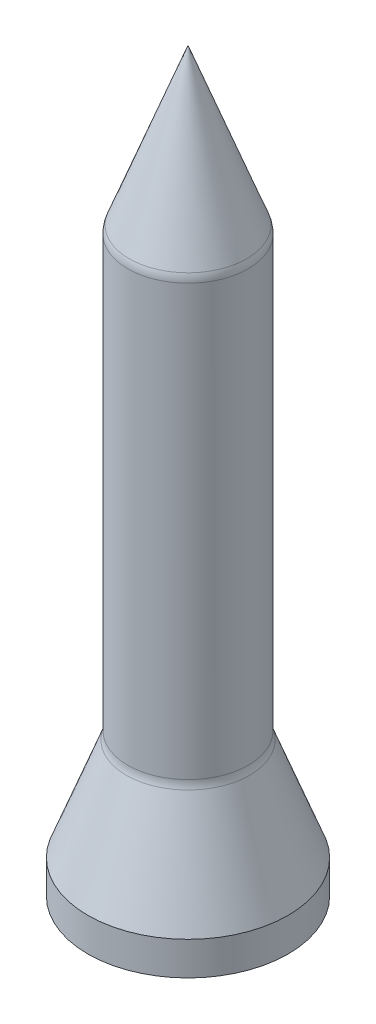
ISO-10303-21;
HEADER;
FILE_DESCRIPTION(('STEP AP214'),'2;1');
FILE_NAME('part.step','',(''),(''),'','','');
FILE_SCHEMA(('AUTOMOTIVE_DESIGN { 1 0 10303 214 1 1 1 1 }'));
ENDSEC;
DATA;
#1=APPLICATION_CONTEXT('core data for automotive mechanical design processes');
#2=APPLICATION_PROTOCOL_DEFINITION('international standard','automotive_design',2000,#1);
#3=PRODUCT_CONTEXT('',#1,'mechanical');
#4=PRODUCT('Part','Part','',(#3));
#5=PRODUCT_RELATED_PRODUCT_CATEGORY('part','',(#4));
#6=PRODUCT_DEFINITION_FORMATION('','',#4);
#7=PRODUCT_DEFINITION_CONTEXT('part definition',#1,'design');
#8=PRODUCT_DEFINITION('design','',#6,#7);
#9=PRODUCT_DEFINITION_SHAPE('','',#8);
#10=(LENGTH_UNIT() NAMED_UNIT(*) SI_UNIT(.MILLI.,.METRE.));
#11=(NAMED_UNIT(*) PLANE_ANGLE_UNIT() SI_UNIT($,.RADIAN.));
#12=(NAMED_UNIT(*) SI_UNIT($,.STERADIAN.) SOLID_ANGLE_UNIT());
#13=UNCERTAINTY_MEASURE_WITH_UNIT(LENGTH_MEASURE(1.E-05),#10,'distance_accuracy_value','');
#14=(GEOMETRIC_REPRESENTATION_CONTEXT(3) GLOBAL_UNCERTAINTY_ASSIGNED_CONTEXT((#13)) GLOBAL_UNIT_ASSIGNED_CONTEXT((#10,
#11,#12)) REPRESENTATION_CONTEXT('',''));
#15=CARTESIAN_POINT('',(0.,0.,0.));
#16=DIRECTION('',(0.,0.,1.));
#17=DIRECTION('',(1.,0.,0.));
#18=AXIS2_PLACEMENT_3D('',#15,#16,#17);
#19=CARTESIAN_POINT('',(0.,148.23200783851,-646.384005101811));
#20=DIRECTION('',(0.,-1.,0.));
#21=DIRECTION('',(0.,0.,-1.));
#22=AXIS2_PLACEMENT_3D('',#19,#20,#21);
#23=CONICAL_SURFACE('',#22,0.0291009481798721,0.0022703622989118);
#24=CARTESIAN_POINT('',(0.,83.0829021728933,-646.384005101811));
#25=DIRECTION('',(0.,1.,0.));
#26=DIRECTION('',(0.,0.,1.));
#27=AXIS2_PLACEMENT_3D('',#24,#25,#26);
#28=CIRCLE('',#27,0.177013275631244);
#29=CARTESIAN_POINT('',(0.,83.0829021728933,-646.561018377442));
#30=VERTEX_POINT('',#29);
#31=EDGE_CURVE('E80',#30,#30,#28,.T.);
#32=CARTESIAN_POINT('',(0.,148.23200783851,-646.384005101811));
#33=DIRECTION('',(0.,1.,0.));
#34=DIRECTION('',(0.,0.,1.));
#35=AXIS2_PLACEMENT_3D('',#32,#33,#34);
#36=CIRCLE('',#35,0.0291009481798721);
#37=CARTESIAN_POINT('',(0.,148.23200783851,-646.413106049991));
#38=VERTEX_POINT('',#37);
#39=EDGE_CURVE('E68',#38,#38,#36,.T.);
#40=CARTESIAN_POINT('',(0.,83.0829021728933,-646.561018377442));
#41=CARTESIAN_POINT('',(0.,83.7615386902435,-646.559477624031));
#42=CARTESIAN_POINT('',(0.,84.4401752075937,-646.55793687062));
#43=CARTESIAN_POINT('',(0.,85.797448242294,-646.554855363798));
#44=CARTESIAN_POINT('',(0.,86.4760847596442,-646.553314610387));
#45=CARTESIAN_POINT('',(0.,87.8333577943445,-646.550233103565));
#46=CARTESIAN_POINT('',(0.,88.5119943116947,-646.548692350154));
#47=CARTESIAN_POINT('',(0.,89.869267346395,-646.545610843332));
#48=CARTESIAN_POINT('',(0.,90.5479038637452,-646.544070089922));
#49=CARTESIAN_POINT('',(0.,91.9051768984455,-646.5409885831));
#50=CARTESIAN_POINT('',(0.,92.5838134157957,-646.539447829689));
#51=CARTESIAN_POINT('',(0.,93.9410864504961,-646.536366322867));
#52=CARTESIAN_POINT('',(0.,94.6197229678462,-646.534825569456));
#53=CARTESIAN_POINT('',(0.,95.9769960025466,-646.531744062634));
#54=CARTESIAN_POINT('',(0.,96.6556325198968,-646.530203309223));
#55=CARTESIAN_POINT('',(0.,98.0129055545971,-646.527121802401));
#56=CARTESIAN_POINT('',(0.,98.6915420719473,-646.52558104899));
#57=CARTESIAN_POINT('',(0.,100.048815106648,-646.522499542168));
#58=CARTESIAN_POINT('',(0.,100.727451623998,-646.520958788757));
#59=CARTESIAN_POINT('',(0.,102.084724658698,-646.517877281935));
#60=CARTESIAN_POINT('',(0.,102.763361176048,-646.516336528524));
#61=CARTESIAN_POINT('',(0.,104.120634210749,-646.513255021703));
#62=CARTESIAN_POINT('',(0.,104.799270728099,-646.511714268292));
#63=CARTESIAN_POINT('',(0.,106.156543762799,-646.50863276147));
#64=CARTESIAN_POINT('',(0.,106.835180280149,-646.507092008059));
#65=CARTESIAN_POINT('',(0.,108.19245331485,-646.504010501237));
#66=CARTESIAN_POINT('',(0.,108.8710898322,-646.502469747826));
#67=CARTESIAN_POINT('',(0.,110.2283628669,-646.499388241004));
#68=CARTESIAN_POINT('',(0.,110.90699938425,-646.497847487593));
#69=CARTESIAN_POINT('',(0.,112.264272418951,-646.494765980771));
#70=CARTESIAN_POINT('',(0.,112.942908936301,-646.49322522736));
#71=CARTESIAN_POINT('',(0.,114.300181971001,-646.490143720538));
#72=CARTESIAN_POINT('',(0.,114.978818488351,-646.488602967127));
#73=CARTESIAN_POINT('',(0.,116.336091523052,-646.485521460305));
#74=CARTESIAN_POINT('',(0.,117.014728040402,-646.483980706894));
#75=CARTESIAN_POINT('',(0.,118.372001075102,-646.480899200073));
#76=CARTESIAN_POINT('',(0.,119.050637592452,-646.479358446662));
#77=CARTESIAN_POINT('',(0.,120.407910627153,-646.47627693984));
#78=CARTESIAN_POINT('',(0.,121.086547144503,-646.474736186429));
#79=CARTESIAN_POINT('',(0.,122.443820179203,-646.471654679607));
#80=CARTESIAN_POINT('',(0.,123.122456696553,-646.470113926196));
#81=CARTESIAN_POINT('',(0.,124.479729731254,-646.467032419374));
#82=CARTESIAN_POINT('',(0.,125.158366248604,-646.465491665963));
#83=CARTESIAN_POINT('',(0.,126.515639283304,-646.462410159141));
#84=CARTESIAN_POINT('',(0.,127.194275800654,-646.46086940573));
#85=CARTESIAN_POINT('',(0.,128.551548835355,-646.457787898908));
#86=CARTESIAN_POINT('',(0.,129.230185352705,-646.456247145497));
#87=CARTESIAN_POINT('',(0.,130.587458387405,-646.453165638675));
#88=CARTESIAN_POINT('',(0.,131.266094904756,-646.451624885265));
#89=CARTESIAN_POINT('',(0.,132.623367939456,-646.448543378443));
#90=CARTESIAN_POINT('',(0.,133.302004456806,-646.447002625032));
#91=CARTESIAN_POINT('',(0.,134.659277491506,-646.44392111821));
#92=CARTESIAN_POINT('',(0.,135.337914008857,-646.442380364799));
#93=CARTESIAN_POINT('',(0.,136.695187043557,-646.439298857977));
#94=CARTESIAN_POINT('',(0.,137.373823560907,-646.437758104566));
#95=CARTESIAN_POINT('',(0.,138.731096595607,-646.434676597744));
#96=CARTESIAN_POINT('',(0.,139.409733112958,-646.433135844333));
#97=CARTESIAN_POINT('',(0.,140.767006147658,-646.430054337511));
#98=CARTESIAN_POINT('',(0.,141.445642665008,-646.4285135841));
#99=CARTESIAN_POINT('',(0.,142.802915699708,-646.425432077278));
#100=CARTESIAN_POINT('',(0.,143.481552217059,-646.423891323867));
#101=CARTESIAN_POINT('',(0.,144.838825251759,-646.420809817045));
#102=CARTESIAN_POINT('',(0.,145.517461769109,-646.419269063635));
#103=CARTESIAN_POINT('',(0.,146.874734803809,-646.416187556813));
#104=CARTESIAN_POINT('',(0.,147.55337132116,-646.414646803402));
#105=CARTESIAN_POINT('',(0.,148.23200783851,-646.413106049991));
#106=B_SPLINE_CURVE_WITH_KNOTS('',3,(#40,#41,#42,#43,#44,#45,#46,#47,#48,#49,#50,#51,#52,#53,
#54,#55,#56,#57,#58,#59,#60,#61,#62,#63,#64,#65,#66,#67,#68,#69,#70,#71,#72,#73,#74,#75,#76,#77,
#78,#79,#80,#81,#82,#83,#84,#85,#86,#87,#88,#89,#90,#91,#92,#93,#94,#95,#96,#97,#98,#99,#100,
#101,#102,#103,#104,#105),.UNSPECIFIED.,.F.,.F.,(4,2,2,2,2,2,2,2,2,2,2,2,2,2,2,2,2,2,2,2,2,2,2,
2,2,2,2,2,2,2,2,2,4),(0.,2.03591479915546,4.07182959831091,6.10774439746636,8.1436591966218,
10.1795739957773,12.2154887949327,14.2514035940882,16.2873183932436,18.3232331923991,
20.3591479915545,22.39506279071,24.4309775898654,26.4668923890209,28.5028071881763,
30.5387219873318,32.5746367864872,34.6105515856427,36.6464663847981,38.6823811839536,
40.718295983109,42.7542107822645,44.7901255814199,46.8260403805754,48.8619551797309,
50.8978699788863,52.9337847780418,54.9696995771972,57.0056143763527,59.0415291755081,
61.0774439746636,63.113358773819,65.1492735729745),.UNSPECIFIED.);
#107=EDGE_CURVE('BSEAM44',#30,#38,#106,.T.);
#108=ORIENTED_EDGE('',*,*,#31,.F.);
#109=ORIENTED_EDGE('',*,*,#39,.T.);
#110=ORIENTED_EDGE('',*,*,#107,.T.);
#111=ORIENTED_EDGE('',*,*,#107,.F.);
#112=EDGE_LOOP('',(#108,#110,#109,#111));
#113=FACE_BOUND('',#112,.T.);
#114=ADVANCED_FACE('F44',(#113),#23,.F.);
#115=CARTESIAN_POINT('',(0.,134.198561363691,-646.384005101811));
#116=DIRECTION('',(0.,-1.,0.));
#117=DIRECTION('',(0.,0.,-1.));
#118=AXIS2_PLACEMENT_3D('',#115,#116,#117);
#119=CONICAL_SURFACE('',#118,5.32649465059509,0.360946156323703);
#120=CARTESIAN_POINT('',(0.,134.539963895392,-646.384005101811));
#121=DIRECTION('',(0.,-1.,0.));
#122=DIRECTION('',(0.,0.,-1.));
#123=AXIS2_PLACEMENT_3D('',#120,#121,#122);
#124=CIRCLE('',#123,5.19762084723763);
#125=CARTESIAN_POINT('',(0.,134.539963895392,-651.581625949048));
#126=VERTEX_POINT('',#125);
#127=EDGE_CURVE('E52',#126,#126,#124,.F.);
#128=CARTESIAN_POINT('',(0.,134.539963895392,-651.581625949048));
#129=CARTESIAN_POINT('',(0.,134.682589353133,-651.5277872001));
#130=CARTESIAN_POINT('',(0.,134.825214810874,-651.473948451151));
#131=CARTESIAN_POINT('',(0.,135.110465726355,-651.366270953254));
#132=CARTESIAN_POINT('',(0.,135.253091184096,-651.312432204306));
#133=CARTESIAN_POINT('',(0.,135.538342099578,-651.204754706409));
#134=CARTESIAN_POINT('',(0.,135.680967557319,-651.15091595746));
#135=CARTESIAN_POINT('',(0.,135.9662184728,-651.043238459563));
#136=CARTESIAN_POINT('',(0.,136.108843930541,-650.989399710615));
#137=CARTESIAN_POINT('',(0.,136.394094846023,-650.881722212718));
#138=CARTESIAN_POINT('',(0.,136.536720303763,-650.827883463769));
#139=CARTESIAN_POINT('',(0.,136.821971219245,-650.720205965872));
#140=CARTESIAN_POINT('',(0.,136.964596676986,-650.666367216924));
#141=CARTESIAN_POINT('',(0.,137.249847592467,-650.558689719027));
#142=CARTESIAN_POINT('',(0.,137.392473050208,-650.504850970078));
#143=CARTESIAN_POINT('',(0.,137.67772396569,-650.397173472181));
#144=CARTESIAN_POINT('',(0.,137.820349423431,-650.343334723232));
#145=CARTESIAN_POINT('',(0.,138.105600338912,-650.235657225335));
#146=CARTESIAN_POINT('',(0.,138.248225796653,-650.181818476387));
#147=CARTESIAN_POINT('',(0.,138.533476712135,-650.07414097849));
#148=CARTESIAN_POINT('',(0.,138.676102169876,-650.020302229541));
#149=CARTESIAN_POINT('',(0.,138.961353085357,-649.912624731644));
#150=CARTESIAN_POINT('',(0.,139.103978543098,-649.858785982696));
#151=CARTESIAN_POINT('',(0.,139.38922945858,-649.751108484799));
#152=CARTESIAN_POINT('',(0.,139.53185491632,-649.69726973585));
#153=CARTESIAN_POINT('',(0.,139.817105831802,-649.589592237953));
#154=CARTESIAN_POINT('',(0.,139.959731289543,-649.535753489005));
#155=CARTESIAN_POINT('',(0.,140.244982205024,-649.428075991108));
#156=CARTESIAN_POINT('',(0.,140.387607662765,-649.374237242159));
#157=CARTESIAN_POINT('',(0.,140.672858578247,-649.266559744262));
#158=CARTESIAN_POINT('',(0.,140.815484035988,-649.212720995314));
#159=CARTESIAN_POINT('',(0.,141.100734951469,-649.105043497417));
#160=CARTESIAN_POINT('',(0.,141.24336040921,-649.051204748468));
#161=CARTESIAN_POINT('',(0.,141.528611324692,-648.943527250571));
#162=CARTESIAN_POINT('',(0.,141.671236782433,-648.889688501623));
#163=CARTESIAN_POINT('',(0.,141.956487697914,-648.782011003726));
#164=CARTESIAN_POINT('',(0.,142.099113155655,-648.728172254777));
#165=CARTESIAN_POINT('',(0.,142.384364071137,-648.62049475688));
#166=CARTESIAN_POINT('',(0.,142.526989528877,-648.566656007931));
#167=CARTESIAN_POINT('',(0.,142.812240444359,-648.458978510034));
#168=CARTESIAN_POINT('',(0.,142.9548659021,-648.405139761086));
#169=CARTESIAN_POINT('',(0.,143.240116817581,-648.297462263189));
#170=CARTESIAN_POINT('',(0.,143.382742275322,-648.24362351424));
#171=CARTESIAN_POINT('',(0.,143.667993190804,-648.135946016343));
#172=CARTESIAN_POINT('',(0.,143.810618648545,-648.082107267395));
#173=CARTESIAN_POINT('',(0.,144.095869564026,-647.974429769498));
#174=CARTESIAN_POINT('',(0.,144.238495021767,-647.920591020549));
#175=CARTESIAN_POINT('',(0.,144.523745937249,-647.812913522652));
#176=CARTESIAN_POINT('',(0.,144.66637139499,-647.759074773704));
#177=CARTESIAN_POINT('',(0.,144.951622310471,-647.651397275807));
#178=CARTESIAN_POINT('',(0.,145.094247768212,-647.597558526858));
#179=CARTESIAN_POINT('',(0.,145.379498683694,-647.489881028961));
#180=CARTESIAN_POINT('',(0.,145.522124141434,-647.436042280013));
#181=CARTESIAN_POINT('',(0.,145.807375056916,-647.328364782116));
#182=CARTESIAN_POINT('',(0.,145.950000514657,-647.274526033167));
#183=CARTESIAN_POINT('',(0.,146.235251430138,-647.16684853527));
#184=CARTESIAN_POINT('',(0.,146.377876887879,-647.113009786321));
#185=CARTESIAN_POINT('',(0.,146.663127803361,-647.005332288424));
#186=CARTESIAN_POINT('',(0.,146.805753261102,-646.951493539476));
#187=CARTESIAN_POINT('',(0.,147.091004176583,-646.843816041579));
#188=CARTESIAN_POINT('',(0.,147.233629634324,-646.78997729263));
#189=CARTESIAN_POINT('',(0.,147.518880549806,-646.682299794733));
#190=CARTESIAN_POINT('',(0.,147.661506007547,-646.628461045785));
#191=CARTESIAN_POINT('',(0.,147.946756923028,-646.520783547888));
#192=CARTESIAN_POINT('',(0.,148.089382380769,-646.466944798939));
#193=CARTESIAN_POINT('',(0.,148.23200783851,-646.413106049991));
#194=B_SPLINE_CURVE_WITH_KNOTS('',3,(#128,#129,#130,#131,#132,#133,#134,#135,#136,#137,#138,
#139,#140,#141,#142,#143,#144,#145,#146,#147,#148,#149,#150,#151,#152,#153,#154,#155,#156,#157,
#158,#159,#160,#161,#162,#163,#164,#165,#166,#167,#168,#169,#170,#171,#172,#173,#174,#175,#176,
#177,#178,#179,#180,#181,#182,#183,#184,#185,#186,#187,#188,#189,#190,#191,#192,#193),
.UNSPECIFIED.,.F.,.F.,(4,2,2,2,2,2,2,2,2,2,2,2,2,2,2,2,2,2,2,2,2,2,2,2,2,2,2,2,2,2,2,2,4),(0.,
0.4573463553556,0.9146927107112,1.3720390660668,1.82938542142239,2.28673177677799,
2.74407813213359,3.20142448748919,3.65877084284481,4.11611719820041,4.57346355355597,
5.0308099089116,5.4881562642672,5.9455026196228,6.4028489749784,6.86019533033402,
7.31754168568958,7.77488804104518,8.23223439640081,8.68958075175641,9.14692710711201,
9.60427346246761,10.0616198178232,10.5189661731788,10.9763125285344,11.43365888389,
11.8910052392456,12.3483515946012,12.8056979499568,13.2630443053124,13.720390660668,
14.1777370160236,14.6350833713792),.UNSPECIFIED.);
#195=EDGE_CURVE('BSEAM90',#126,#38,#194,.T.);
#196=ORIENTED_EDGE('',*,*,#127,.T.);
#197=ORIENTED_EDGE('',*,*,#39,.F.);
#198=ORIENTED_EDGE('',*,*,#195,.T.);
#199=ORIENTED_EDGE('',*,*,#195,.F.);
#200=EDGE_LOOP('',(#196,#198,#197,#199));
#201=FACE_BOUND('',#200,.T.);
#202=ADVANCED_FACE('F90',(#201),#119,.T.);
#203=CARTESIAN_POINT('',(0.,148.309099824039,-646.384005101811));
#204=DIRECTION('',(0.,1.,0.));
#205=DIRECTION('',(0.,0.,1.));
#206=AXIS2_PLACEMENT_3D('',#203,#204,#205);
#207=CYLINDRICAL_SURFACE('',#206,5.32649465059509);
#208=CARTESIAN_POINT('',(0.,133.83364473507,-646.384005101811));
#209=DIRECTION('',(0.,-1.,0.));
#210=DIRECTION('',(0.,0.,-1.));
#211=AXIS2_PLACEMENT_3D('',#208,#209,#210);
#212=CIRCLE('',#211,5.32649465059509);
#213=CARTESIAN_POINT('',(0.,133.83364473507,-651.710499752406));
#214=VERTEX_POINT('',#213);
#215=EDGE_CURVE('E10',#214,#214,#212,.T.);
#216=ORIENTED_EDGE('',*,*,#215,.T.);
#217=EDGE_LOOP('',(#216));
#218=FACE_BOUND('',#217,.T.);
#219=CARTESIAN_POINT('',(0.,95.7828590449971,-646.384005101811));
#220=DIRECTION('',(0.,1.,0.));
#221=DIRECTION('',(0.,0.,1.));
#222=AXIS2_PLACEMENT_3D('',#219,#220,#221);
#223=CIRCLE('',#222,5.32649465059509);
#224=CARTESIAN_POINT('',(0.,95.7828590449971,-641.057510451216));
#225=VERTEX_POINT('',#224);
#226=EDGE_CURVE('E62',#225,#225,#223,.T.);
#227=ORIENTED_EDGE('',*,*,#226,.T.);
#228=EDGE_LOOP('',(#227));
#229=FACE_BOUND('',#228,.T.);
#230=ADVANCED_FACE('F95',(#218,#229),#207,.T.);
#231=CARTESIAN_POINT('',(0.,95.4179424163764,-646.384005101811));
#232=DIRECTION('',(0.,-1.,0.));
#233=DIRECTION('',(0.,0.,-1.));
#234=AXIS2_PLACEMENT_3D('',#231,#232,#233);
#235=CONICAL_SURFACE('',#234,5.32649465059509,0.360946156323703);
#236=CARTESIAN_POINT('',(0.,95.0765398846751,-646.384005101811));
#237=DIRECTION('',(0.,-1.,0.));
#238=DIRECTION('',(0.,0.,-1.));
#239=AXIS2_PLACEMENT_3D('',#236,#237,#238);
#240=CIRCLE('',#239,5.45536845395256);
#241=CARTESIAN_POINT('',(0.,95.0765398846751,-651.839373555763));
#242=VERTEX_POINT('',#241);
#243=EDGE_CURVE('E57',#242,#242,#240,.T.);
#244=ORIENTED_EDGE('',*,*,#243,.T.);
#245=EDGE_LOOP('',(#244));
#246=FACE_BOUND('',#245,.T.);
#247=CARTESIAN_POINT('',(0.,86.0454031849215,-646.384005101811));
#248=DIRECTION('',(0.,1.,0.));
#249=DIRECTION('',(0.,0.,1.));
#250=AXIS2_PLACEMENT_3D('',#247,#248,#249);
#251=CIRCLE('',#250,8.86447303597881);
#252=CARTESIAN_POINT('',(0.,86.0454031849215,-637.519532065832));
#253=VERTEX_POINT('',#252);
#254=EDGE_CURVE('E72',#253,#253,#251,.T.);
#255=ORIENTED_EDGE('',*,*,#254,.T.);
#256=EDGE_LOOP('',(#255));
#257=FACE_BOUND('',#256,.T.);
#258=ADVANCED_FACE('F101',(#246,#257),#235,.T.);
#259=CARTESIAN_POINT('',(0.,148.309099824039,-646.384005101811));
#260=DIRECTION('',(0.,1.,0.));
#261=DIRECTION('',(0.,0.,1.));
#262=AXIS2_PLACEMENT_3D('',#259,#260,#261);
#263=CYLINDRICAL_SURFACE('',#262,8.86447303597881);
#264=CARTESIAN_POINT('',(0.,83.0829021728933,-646.384005101811));
#265=DIRECTION('',(0.,1.,0.));
#266=DIRECTION('',(0.,0.,1.));
#267=AXIS2_PLACEMENT_3D('',#264,#265,#266);
#268=CIRCLE('',#267,8.86447303597881);
#269=CARTESIAN_POINT('',(0.,83.0829021728933,-637.519532065832));
#270=VERTEX_POINT('',#269);
#271=EDGE_CURVE('E76',#270,#270,#268,.T.);
#272=ORIENTED_EDGE('',*,*,#271,.T.);
#273=EDGE_LOOP('',(#272));
#274=FACE_BOUND('',#273,.T.);
#275=ORIENTED_EDGE('',*,*,#254,.F.);
#276=EDGE_LOOP('',(#275));
#277=FACE_BOUND('',#276,.T.);
#278=ADVANCED_FACE('F112',(#274,#277),#263,.T.);
#279=CARTESIAN_POINT('',(0.,83.0829021728933,0.));
#280=DIRECTION('',(0.,-1.,0.));
#281=DIRECTION('',(0.,0.,-1.));
#282=AXIS2_PLACEMENT_3D('',#279,#280,#281);
#283=PLANE('',#282);
#284=ORIENTED_EDGE('',*,*,#31,.T.);
#285=EDGE_LOOP('',(#284));
#286=FACE_BOUND('',#285,.T.);
#287=ORIENTED_EDGE('',*,*,#271,.F.);
#288=EDGE_LOOP('',(#287));
#289=FACE_BOUND('',#288,.T.);
#290=ADVANCED_FACE('F85',(#286,#289),#283,.T.);
#291=CARTESIAN_POINT('',(0.,95.7828590449971,-646.384005101811));
#292=DIRECTION('',(0.,1.,0.));
#293=DIRECTION('',(0.,0.,1.));
#294=AXIS2_PLACEMENT_3D('',#291,#292,#293);
#295=TOROIDAL_SURFACE('',#294,7.32649465059509,2.);
#296=ORIENTED_EDGE('',*,*,#243,.F.);
#297=EDGE_LOOP('',(#296));
#298=FACE_BOUND('',#297,.T.);
#299=ORIENTED_EDGE('',*,*,#226,.F.);
#300=EDGE_LOOP('',(#299));
#301=FACE_BOUND('',#300,.T.);
#302=ADVANCED_FACE('F104',(#298,#301),#295,.F.);
#303=CARTESIAN_POINT('',(0.,133.83364473507,-646.384005101811));
#304=DIRECTION('',(0.,-1.,0.));
#305=DIRECTION('',(0.,0.,-1.));
#306=AXIS2_PLACEMENT_3D('',#303,#304,#305);
#307=TOROIDAL_SURFACE('',#306,3.32649465059509,2.);
#308=ORIENTED_EDGE('',*,*,#215,.F.);
#309=EDGE_LOOP('',(#308));
#310=FACE_BOUND('',#309,.T.);
#311=ORIENTED_EDGE('',*,*,#127,.F.);
#312=EDGE_LOOP('',(#311));
#313=FACE_BOUND('',#312,.T.);
#314=ADVANCED_FACE('F46',(#310,#313),#307,.T.);
#315=CLOSED_SHELL('',(#114,#202,#230,#258,#278,#290,#302,#314));
#316=MANIFOLD_SOLID_BREP('B2',#315);
#317=ADVANCED_BREP_SHAPE_REPRESENTATION('',(#18,#316),#14);
#318=SHAPE_DEFINITION_REPRESENTATION(#9,#317);
ENDSEC;
END-ISO-10303-21;
